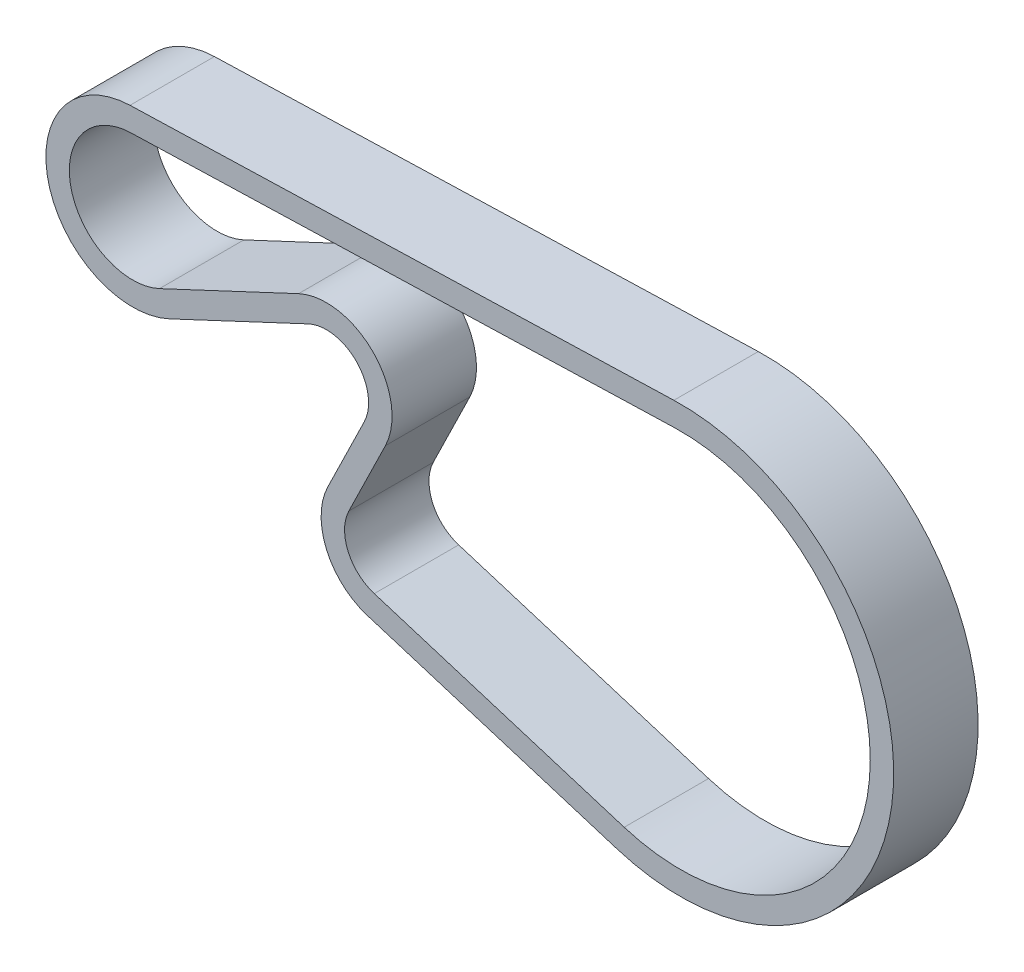
ISO-10303-21;
HEADER;
FILE_DESCRIPTION(('STEP AP214'),'2;1');
FILE_NAME('part.step','',(''),(''),'','','');
FILE_SCHEMA(('AUTOMOTIVE_DESIGN { 1 0 10303 214 1 1 1 1 }'));
ENDSEC;
DATA;
#1=APPLICATION_CONTEXT('core data for automotive mechanical design processes');
#2=APPLICATION_PROTOCOL_DEFINITION('international standard','automotive_design',2000,#1);
#3=PRODUCT_CONTEXT('',#1,'mechanical');
#4=PRODUCT('Part','Part','',(#3));
#5=PRODUCT_RELATED_PRODUCT_CATEGORY('part','',(#4));
#6=PRODUCT_DEFINITION_FORMATION('','',#4);
#7=PRODUCT_DEFINITION_CONTEXT('part definition',#1,'design');
#8=PRODUCT_DEFINITION('design','',#6,#7);
#9=PRODUCT_DEFINITION_SHAPE('','',#8);
#10=(LENGTH_UNIT() NAMED_UNIT(*) SI_UNIT(.MILLI.,.METRE.));
#11=(NAMED_UNIT(*) PLANE_ANGLE_UNIT() SI_UNIT($,.RADIAN.));
#12=(NAMED_UNIT(*) SI_UNIT($,.STERADIAN.) SOLID_ANGLE_UNIT());
#13=UNCERTAINTY_MEASURE_WITH_UNIT(LENGTH_MEASURE(1.E-05),#10,'distance_accuracy_value','');
#14=(GEOMETRIC_REPRESENTATION_CONTEXT(3) GLOBAL_UNCERTAINTY_ASSIGNED_CONTEXT((#13)) GLOBAL_UNIT_ASSIGNED_CONTEXT((#10,
#11,#12)) REPRESENTATION_CONTEXT('',''));
#15=CARTESIAN_POINT('',(0.,0.,0.));
#16=DIRECTION('',(0.,0.,1.));
#17=DIRECTION('',(1.,0.,0.));
#18=AXIS2_PLACEMENT_3D('',#15,#16,#17);
#19=CARTESIAN_POINT('',(108.474760740277,-125.042647423349,-8.));
#20=DIRECTION('',(0.,0.,1.));
#21=DIRECTION('',(1.,0.,0.));
#22=AXIS2_PLACEMENT_3D('',#19,#20,#21);
#23=CYLINDRICAL_SURFACE('',#22,28.);
#24=DIRECTION('',(0.,0.,1.));
#25=VECTOR('',#24,1.);
#26=CARTESIAN_POINT('',(100.191052218173,-151.789239227182,-8.));
#27=LINE('',#26,#25);
#28=CARTESIAN_POINT('',(100.191052218173,-151.789239227182,-8.));
#29=VERTEX_POINT('',#28);
#30=CARTESIAN_POINT('',(100.191052218173,-151.789239227182,28.));
#31=VERTEX_POINT('',#30);
#32=EDGE_CURVE('E140',#29,#31,#27,.T.);
#33=ORIENTED_EDGE('',*,*,#32,.T.);
#34=CARTESIAN_POINT('',(108.474760740277,-125.042647423349,28.));
#35=DIRECTION('',(0.,0.,1.));
#36=DIRECTION('',(1.,0.,0.));
#37=AXIS2_PLACEMENT_3D('',#34,#35,#36);
#38=CIRCLE('',#37,28.);
#39=CARTESIAN_POINT('',(83.3166482224011,-112.75161921014,28.));
#40=VERTEX_POINT('',#39);
#41=EDGE_CURVE('E308',#40,#31,#38,.T.);
#42=ORIENTED_EDGE('',*,*,#41,.F.);
#43=DIRECTION('',(0.,0.,1.));
#44=VECTOR('',#43,1.);
#45=CARTESIAN_POINT('',(83.3166482224011,-112.75161921014,-8.00000000000001));
#46=LINE('',#45,#44);
#47=CARTESIAN_POINT('',(83.3166482224011,-112.75161921014,-8.00000000000001));
#48=VERTEX_POINT('',#47);
#49=EDGE_CURVE('E12',#48,#40,#46,.T.);
#50=ORIENTED_EDGE('',*,*,#49,.F.);
#51=CARTESIAN_POINT('',(108.474760740277,-125.042647423349,-8.));
#52=DIRECTION('',(0.,0.,1.));
#53=DIRECTION('',(1.,0.,0.));
#54=AXIS2_PLACEMENT_3D('',#51,#52,#53);
#55=CIRCLE('',#54,28.);
#56=EDGE_CURVE('E359',#48,#29,#55,.T.);
#57=ORIENTED_EDGE('',*,*,#56,.T.);
#58=EDGE_LOOP('',(#33,#42,#50,#57));
#59=FACE_BOUND('',#58,.T.);
#60=ADVANCED_FACE('F137',(#59),#23,.T.);
#61=CARTESIAN_POINT('',(83.3166482224011,-112.75161921014,-8.));
#62=DIRECTION('',(-0.898504018495562,0.4389652933289,0.));
#63=DIRECTION('',(-0.4389652933289,-0.898504018495562,0.));
#64=AXIS2_PLACEMENT_3D('',#61,#62,#63);
#65=PLANE('',#64);
#66=ORIENTED_EDGE('',*,*,#49,.T.);
#67=DIRECTION('',(-0.4389652933289,-0.898504018495562,0.));
#68=VECTOR('',#67,1.);
#69=CARTESIAN_POINT('',(83.3166482224011,-112.75161921014,28.));
#70=LINE('',#69,#68);
#71=CARTESIAN_POINT('',(98.908753855671,-80.8366369069642,28.));
#72=VERTEX_POINT('',#71);
#73=EDGE_CURVE('E333',#72,#40,#70,.T.);
#74=ORIENTED_EDGE('',*,*,#73,.F.);
#75=DIRECTION('',(0.,0.,1.));
#76=VECTOR('',#75,1.);
#77=CARTESIAN_POINT('',(98.908753855671,-80.8366369069642,-8.));
#78=LINE('',#77,#76);
#79=CARTESIAN_POINT('',(98.908753855671,-80.8366369069642,-8.));
#80=VERTEX_POINT('',#79);
#81=EDGE_CURVE('E145',#80,#72,#78,.T.);
#82=ORIENTED_EDGE('',*,*,#81,.F.);
#83=DIRECTION('',(-0.4389652933289,-0.898504018495562,0.));
#84=VECTOR('',#83,1.);
#85=CARTESIAN_POINT('',(83.3166482224011,-112.75161921014,-8.));
#86=LINE('',#85,#84);
#87=EDGE_CURVE('E397',#80,#48,#86,.T.);
#88=ORIENTED_EDGE('',*,*,#87,.T.);
#89=EDGE_LOOP('',(#66,#74,#82,#88));
#90=FACE_BOUND('',#89,.T.);
#91=ADVANCED_FACE('F421',(#90),#65,.T.);
#92=CARTESIAN_POINT('',(82.735681522751,-72.9352616270441,-8.));
#93=DIRECTION('',(0.,0.,1.));
#94=DIRECTION('',(1.,0.,0.));
#95=AXIS2_PLACEMENT_3D('',#92,#93,#94);
#96=CYLINDRICAL_SURFACE('',#95,18.);
#97=ORIENTED_EDGE('',*,*,#81,.T.);
#98=CARTESIAN_POINT('',(82.735681522751,-72.9352616270441,28.));
#99=DIRECTION('',(0.,0.,1.));
#100=DIRECTION('',(1.,0.,0.));
#101=AXIS2_PLACEMENT_3D('',#98,#99,#100);
#102=CIRCLE('',#101,18.);
#103=CARTESIAN_POINT('',(75.0976330502479,-56.6361752866477,28.));
#104=VERTEX_POINT('',#103);
#105=EDGE_CURVE('E329',#104,#72,#102,.F.);
#106=ORIENTED_EDGE('',*,*,#105,.F.);
#107=DIRECTION('',(0.,0.,1.));
#108=VECTOR('',#107,1.);
#109=CARTESIAN_POINT('',(75.0976330502479,-56.6361752866477,-8.00000000000001));
#110=LINE('',#109,#108);
#111=CARTESIAN_POINT('',(75.0976330502479,-56.6361752866477,-8.00000000000001));
#112=VERTEX_POINT('',#111);
#113=EDGE_CURVE('E401',#112,#104,#110,.T.);
#114=ORIENTED_EDGE('',*,*,#113,.F.);
#115=CARTESIAN_POINT('',(82.735681522751,-72.9352616270441,-8.));
#116=DIRECTION('',(0.,0.,1.));
#117=DIRECTION('',(1.,0.,0.));
#118=AXIS2_PLACEMENT_3D('',#115,#116,#117);
#119=CIRCLE('',#118,18.);
#120=EDGE_CURVE('E393',#112,#80,#119,.F.);
#121=ORIENTED_EDGE('',*,*,#120,.T.);
#122=EDGE_LOOP('',(#97,#106,#114,#121));
#123=FACE_BOUND('',#122,.T.);
#124=ADVANCED_FACE('F442',(#123),#96,.F.);
#125=CARTESIAN_POINT('',(75.0976330502479,-56.6361752866477,-8.));
#126=DIRECTION('',(0.424336026250168,-0.905504796688685,0.));
#127=DIRECTION('',(0.905504796688685,0.424336026250168,0.));
#128=AXIS2_PLACEMENT_3D('',#125,#126,#127);
#129=PLANE('',#128);
#130=ORIENTED_EDGE('',*,*,#113,.T.);
#131=DIRECTION('',(0.905504796688685,0.424336026250168,0.));
#132=VECTOR('',#131,1.);
#133=CARTESIAN_POINT('',(75.0976330502479,-56.6361752866477,28.));
#134=LINE('',#133,#132);
#135=CARTESIAN_POINT('',(15.7799727563137,-84.4335103727026,28.));
#136=VERTEX_POINT('',#135);
#137=EDGE_CURVE('E325',#136,#104,#134,.T.);
#138=ORIENTED_EDGE('',*,*,#137,.F.);
#139=DIRECTION('',(0.,0.,1.));
#140=VECTOR('',#139,1.);
#141=CARTESIAN_POINT('',(15.7799727563137,-84.4335103727026,-8.));
#142=LINE('',#141,#140);
#143=CARTESIAN_POINT('',(15.7799727563137,-84.4335103727026,-8.));
#144=VERTEX_POINT('',#143);
#145=EDGE_CURVE('E404',#144,#136,#142,.T.);
#146=ORIENTED_EDGE('',*,*,#145,.F.);
#147=DIRECTION('',(0.905504796688685,0.424336026250168,0.));
#148=VECTOR('',#147,1.);
#149=CARTESIAN_POINT('',(75.0976330502479,-56.6361752866477,-8.));
#150=LINE('',#149,#148);
#151=EDGE_CURVE('E389',#144,#112,#150,.T.);
#152=ORIENTED_EDGE('',*,*,#151,.T.);
#153=EDGE_LOOP('',(#130,#138,#146,#152));
#154=FACE_BOUND('',#153,.T.);
#155=ADVANCED_FACE('F439',(#154),#129,.T.);
#156=CARTESIAN_POINT('',(0.0795397850574812,-50.9298328952213,-8.));
#157=DIRECTION('',(0.,0.,1.));
#158=DIRECTION('',(1.,0.,0.));
#159=AXIS2_PLACEMENT_3D('',#156,#157,#158);
#160=CYLINDRICAL_SURFACE('',#159,37.);
#161=ORIENTED_EDGE('',*,*,#145,.T.);
#162=CARTESIAN_POINT('',(0.0795397850574812,-50.9298328952213,28.));
#163=DIRECTION('',(0.,0.,1.));
#164=DIRECTION('',(1.,0.,0.));
#165=AXIS2_PLACEMENT_3D('',#162,#163,#164);
#166=CIRCLE('',#165,37.);
#167=CARTESIAN_POINT('',(-1.04109620277107,-13.9468073972609,28.));
#168=VERTEX_POINT('',#167);
#169=EDGE_CURVE('E321',#168,#136,#166,.T.);
#170=ORIENTED_EDGE('',*,*,#169,.F.);
#171=DIRECTION('',(0.,0.,1.));
#172=VECTOR('',#171,1.);
#173=CARTESIAN_POINT('',(-1.04109620277107,-13.9468073972609,-8.00000000000001));
#174=LINE('',#173,#172);
#175=CARTESIAN_POINT('',(-1.04109620277107,-13.9468073972609,-8.00000000000001));
#176=VERTEX_POINT('',#175);
#177=EDGE_CURVE('E407',#176,#168,#174,.T.);
#178=ORIENTED_EDGE('',*,*,#177,.F.);
#179=CARTESIAN_POINT('',(0.0795397850574812,-50.9298328952213,-8.));
#180=DIRECTION('',(0.,0.,1.));
#181=DIRECTION('',(1.,0.,0.));
#182=AXIS2_PLACEMENT_3D('',#179,#180,#181);
#183=CIRCLE('',#182,37.);
#184=EDGE_CURVE('E385',#176,#144,#183,.T.);
#185=ORIENTED_EDGE('',*,*,#184,.T.);
#186=EDGE_LOOP('',(#161,#170,#178,#185));
#187=FACE_BOUND('',#186,.T.);
#188=ADVANCED_FACE('F437',(#187),#160,.T.);
#189=CARTESIAN_POINT('',(230.94875563699,-6.91719926536325,-8.));
#190=DIRECTION('',(-0.0302874591305004,0.999541229674603,0.));
#191=DIRECTION('',(-0.999541229674604,-0.0302874591305004,0.));
#192=AXIS2_PLACEMENT_3D('',#189,#190,#191);
#193=PLANE('',#192);
#194=ORIENTED_EDGE('',*,*,#177,.T.);
#195=DIRECTION('',(-0.999541229674603,-0.0302874591305004,0.));
#196=VECTOR('',#195,1.);
#197=CARTESIAN_POINT('',(230.94875563699,-6.91719926536325,28.));
#198=LINE('',#197,#196);
#199=CARTESIAN_POINT('',(230.94875563699,-6.91719926536326,28.));
#200=VERTEX_POINT('',#199);
#201=EDGE_CURVE('E317',#200,#168,#198,.T.);
#202=ORIENTED_EDGE('',*,*,#201,.F.);
#203=DIRECTION('',(0.,0.,1.));
#204=VECTOR('',#203,1.);
#205=CARTESIAN_POINT('',(230.94875563699,-6.91719926536326,-8.));
#206=LINE('',#205,#204);
#207=CARTESIAN_POINT('',(230.94875563699,-6.91719926536326,-8.));
#208=VERTEX_POINT('',#207);
#209=EDGE_CURVE('E410',#208,#200,#206,.T.);
#210=ORIENTED_EDGE('',*,*,#209,.F.);
#211=DIRECTION('',(-0.999541229674603,-0.0302874591305004,0.));
#212=VECTOR('',#211,1.);
#213=CARTESIAN_POINT('',(230.94875563699,-6.91719926536325,-8.));
#214=LINE('',#213,#212);
#215=EDGE_CURVE('E381',#208,#176,#214,.T.);
#216=ORIENTED_EDGE('',*,*,#215,.T.);
#217=EDGE_LOOP('',(#194,#202,#210,#216));
#218=FACE_BOUND('',#217,.T.);
#219=ADVANCED_FACE('F435',(#218),#193,.T.);
#220=CARTESIAN_POINT('',(233.704914417865,-97.8754511657522,-8.));
#221=DIRECTION('',(0.,0.,1.));
#222=DIRECTION('',(1.,0.,0.));
#223=AXIS2_PLACEMENT_3D('',#220,#221,#222);
#224=CYLINDRICAL_SURFACE('',#223,91.);
#225=ORIENTED_EDGE('',*,*,#209,.T.);
#226=CARTESIAN_POINT('',(233.704914417865,-97.8754511657522,28.));
#227=DIRECTION('',(0.,0.,1.));
#228=DIRECTION('',(1.,0.,0.));
#229=AXIS2_PLACEMENT_3D('',#226,#227,#228);
#230=CIRCLE('',#229,91.);
#231=CARTESIAN_POINT('',(206.782861721027,-184.801874528206,28.));
#232=VERTEX_POINT('',#231);
#233=EDGE_CURVE('E314',#232,#200,#230,.T.);
#234=ORIENTED_EDGE('',*,*,#233,.F.);
#235=DIRECTION('',(0.,0.,1.));
#236=VECTOR('',#235,1.);
#237=CARTESIAN_POINT('',(206.782861721027,-184.801874528206,-8.));
#238=LINE('',#237,#236);
#239=CARTESIAN_POINT('',(206.782861721027,-184.801874528206,-8.));
#240=VERTEX_POINT('',#239);
#241=EDGE_CURVE('E411',#240,#232,#238,.T.);
#242=ORIENTED_EDGE('',*,*,#241,.F.);
#243=CARTESIAN_POINT('',(233.704914417865,-97.8754511657522,-8.));
#244=DIRECTION('',(0.,0.,1.));
#245=DIRECTION('',(1.,0.,0.));
#246=AXIS2_PLACEMENT_3D('',#243,#244,#245);
#247=CIRCLE('',#246,91.);
#248=EDGE_CURVE('E378',#240,#208,#247,.T.);
#249=ORIENTED_EDGE('',*,*,#248,.T.);
#250=EDGE_LOOP('',(#225,#234,#242,#249));
#251=FACE_BOUND('',#250,.T.);
#252=ADVANCED_FACE('F431',(#251),#224,.T.);
#253=CARTESIAN_POINT('',(100.191052218173,-151.789239227182,-8.));
#254=DIRECTION('',(-0.295846732932291,-0.955235421565433,0.));
#255=DIRECTION('',(0.955235421565433,-0.295846732932291,0.));
#256=AXIS2_PLACEMENT_3D('',#253,#254,#255);
#257=PLANE('',#256);
#258=ORIENTED_EDGE('',*,*,#241,.T.);
#259=DIRECTION('',(0.955235421565433,-0.295846732932291,0.));
#260=VECTOR('',#259,1.);
#261=CARTESIAN_POINT('',(100.191052218173,-151.789239227182,28.));
#262=LINE('',#261,#260);
#263=EDGE_CURVE('E311',#31,#232,#262,.T.);
#264=ORIENTED_EDGE('',*,*,#263,.F.);
#265=ORIENTED_EDGE('',*,*,#32,.F.);
#266=DIRECTION('',(0.955235421565433,-0.295846732932291,0.));
#267=VECTOR('',#266,1.);
#268=CARTESIAN_POINT('',(100.191052218173,-151.789239227182,-8.));
#269=LINE('',#268,#267);
#270=EDGE_CURVE('E375',#29,#240,#269,.T.);
#271=ORIENTED_EDGE('',*,*,#270,.T.);
#272=EDGE_LOOP('',(#258,#264,#265,#271));
#273=FACE_BOUND('',#272,.T.);
#274=ADVANCED_FACE('F415',(#273),#257,.T.);
#275=CARTESIAN_POINT('',(108.474760740277,-125.042647423349,-8.));
#276=DIRECTION('',(0.,0.,1.));
#277=DIRECTION('',(1.,0.,0.));
#278=AXIS2_PLACEMENT_3D('',#275,#276,#277);
#279=PLANE('',#278);
#280=DIRECTION('',(-0.4389652933289,-0.898504018495562,0.));
#281=VECTOR('',#280,1.);
#282=CARTESIAN_POINT('',(92.3016884073567,-117.141272143429,-8.));
#283=LINE('',#282,#281);
#284=CARTESIAN_POINT('',(107.893794040627,-85.2262898402533,-8.));
#285=VERTEX_POINT('',#284);
#286=CARTESIAN_POINT('',(92.3016884073567,-117.141272143429,-8.00000000000001));
#287=VERTEX_POINT('',#286);
#288=EDGE_CURVE('E273',#285,#287,#283,.T.);
#289=ORIENTED_EDGE('',*,*,#288,.T.);
#290=CARTESIAN_POINT('',(108.474760740277,-125.042647423349,-8.));
#291=DIRECTION('',(0.,0.,1.));
#292=DIRECTION('',(1.,0.,0.));
#293=AXIS2_PLACEMENT_3D('',#290,#291,#292);
#294=CIRCLE('',#293,18.);
#295=CARTESIAN_POINT('',(103.149519547496,-142.236885011527,-8.));
#296=VERTEX_POINT('',#295);
#297=EDGE_CURVE('E336',#287,#296,#294,.T.);
#298=ORIENTED_EDGE('',*,*,#297,.T.);
#299=DIRECTION('',(0.955235421565433,-0.295846732932291,0.));
#300=VECTOR('',#299,1.);
#301=CARTESIAN_POINT('',(103.149519547496,-142.236885011527,-8.));
#302=LINE('',#301,#300);
#303=CARTESIAN_POINT('',(209.74132905035,-175.249520312552,-8.));
#304=VERTEX_POINT('',#303);
#305=EDGE_CURVE('E268',#296,#304,#302,.T.);
#306=ORIENTED_EDGE('',*,*,#305,.T.);
#307=CARTESIAN_POINT('',(233.704914417865,-97.8754511657522,-8.));
#308=DIRECTION('',(0.,0.,1.));
#309=DIRECTION('',(1.,0.,0.));
#310=AXIS2_PLACEMENT_3D('',#307,#308,#309);
#311=CIRCLE('',#310,81.);
#312=CARTESIAN_POINT('',(231.251630228295,-16.9126115621093,-8.));
#313=VERTEX_POINT('',#312);
#314=EDGE_CURVE('E153',#304,#313,#311,.T.);
#315=ORIENTED_EDGE('',*,*,#314,.T.);
#316=DIRECTION('',(-0.999541229674603,-0.0302874591305004,0.));
#317=VECTOR('',#316,1.);
#318=CARTESIAN_POINT('',(231.251630228295,-16.9126115621093,-8.));
#319=LINE('',#318,#317);
#320=CARTESIAN_POINT('',(-0.738221611466056,-23.942219694007,-8.00000000000001));
#321=VERTEX_POINT('',#320);
#322=EDGE_CURVE('E340',#313,#321,#319,.T.);
#323=ORIENTED_EDGE('',*,*,#322,.T.);
#324=CARTESIAN_POINT('',(0.0795397850574812,-50.9298328952213,-8.));
#325=DIRECTION('',(0.,0.,1.));
#326=DIRECTION('',(1.,0.,0.));
#327=AXIS2_PLACEMENT_3D('',#324,#325,#326);
#328=CIRCLE('',#327,27.);
#329=CARTESIAN_POINT('',(11.536612493812,-75.3784624058158,-8.));
#330=VERTEX_POINT('',#329);
#331=EDGE_CURVE('E344',#321,#330,#328,.T.);
#332=ORIENTED_EDGE('',*,*,#331,.T.);
#333=DIRECTION('',(0.905504796688685,0.424336026250168,0.));
#334=VECTOR('',#333,1.);
#335=CARTESIAN_POINT('',(70.8542727877463,-47.5811273197609,-8.));
#336=LINE('',#335,#334);
#337=CARTESIAN_POINT('',(70.8542727877462,-47.5811273197609,-8.00000000000001));
#338=VERTEX_POINT('',#337);
#339=EDGE_CURVE('E348',#330,#338,#336,.T.);
#340=ORIENTED_EDGE('',*,*,#339,.T.);
#341=CARTESIAN_POINT('',(82.735681522751,-72.9352616270441,-8.));
#342=DIRECTION('',(0.,0.,1.));
#343=DIRECTION('',(1.,0.,0.));
#344=AXIS2_PLACEMENT_3D('',#341,#342,#343);
#345=CIRCLE('',#344,28.);
#346=EDGE_CURVE('E352',#338,#285,#345,.F.);
#347=ORIENTED_EDGE('',*,*,#346,.T.);
#348=EDGE_LOOP('',(#289,#298,#306,#315,#323,#332,#340,#347));
#349=FACE_BOUND('',#348,.T.);
#350=ORIENTED_EDGE('',*,*,#56,.F.);
#351=ORIENTED_EDGE('',*,*,#87,.F.);
#352=ORIENTED_EDGE('',*,*,#120,.F.);
#353=ORIENTED_EDGE('',*,*,#151,.F.);
#354=ORIENTED_EDGE('',*,*,#184,.F.);
#355=ORIENTED_EDGE('',*,*,#215,.F.);
#356=ORIENTED_EDGE('',*,*,#248,.F.);
#357=ORIENTED_EDGE('',*,*,#270,.F.);
#358=EDGE_LOOP('',(#350,#351,#352,#353,#354,#355,#356,#357));
#359=FACE_BOUND('',#358,.T.);
#360=ADVANCED_FACE('F425',(#349,#359),#279,.F.);
#361=CARTESIAN_POINT('',(108.474760740277,-125.042647423349,-8.));
#362=DIRECTION('',(0.,0.,1.));
#363=DIRECTION('',(1.,0.,0.));
#364=AXIS2_PLACEMENT_3D('',#361,#362,#363);
#365=CYLINDRICAL_SURFACE('',#364,18.);
#366=DIRECTION('',(0.,0.,1.));
#367=VECTOR('',#366,1.);
#368=CARTESIAN_POINT('',(92.3016884073567,-117.141272143429,-8.00000000000001));
#369=LINE('',#368,#367);
#370=CARTESIAN_POINT('',(92.3016884073567,-117.141272143429,28.));
#371=VERTEX_POINT('',#370);
#372=EDGE_CURVE('E278',#287,#371,#369,.T.);
#373=ORIENTED_EDGE('',*,*,#372,.T.);
#374=CARTESIAN_POINT('',(108.474760740277,-125.042647423349,28.));
#375=DIRECTION('',(0.,0.,1.));
#376=DIRECTION('',(1.,0.,0.));
#377=AXIS2_PLACEMENT_3D('',#374,#375,#376);
#378=CIRCLE('',#377,18.);
#379=CARTESIAN_POINT('',(103.149519547496,-142.236885011527,28.));
#380=VERTEX_POINT('',#379);
#381=EDGE_CURVE('E276',#371,#380,#378,.T.);
#382=ORIENTED_EDGE('',*,*,#381,.T.);
#383=DIRECTION('',(0.,0.,1.));
#384=VECTOR('',#383,1.);
#385=CARTESIAN_POINT('',(103.149519547496,-142.236885011527,-8.));
#386=LINE('',#385,#384);
#387=EDGE_CURVE('E261',#296,#380,#386,.T.);
#388=ORIENTED_EDGE('',*,*,#387,.F.);
#389=ORIENTED_EDGE('',*,*,#297,.F.);
#390=EDGE_LOOP('',(#373,#382,#388,#389));
#391=FACE_BOUND('',#390,.T.);
#392=ADVANCED_FACE('F277',(#391),#365,.F.);
#393=CARTESIAN_POINT('',(92.3016884073567,-117.141272143429,-8.));
#394=DIRECTION('',(-0.898504018495562,0.4389652933289,0.));
#395=DIRECTION('',(-0.4389652933289,-0.898504018495562,0.));
#396=AXIS2_PLACEMENT_3D('',#393,#394,#395);
#397=PLANE('',#396);
#398=DIRECTION('',(0.,0.,1.));
#399=VECTOR('',#398,1.);
#400=CARTESIAN_POINT('',(107.893794040627,-85.2262898402533,-8.));
#401=LINE('',#400,#399);
#402=CARTESIAN_POINT('',(107.893794040627,-85.2262898402533,28.));
#403=VERTEX_POINT('',#402);
#404=EDGE_CURVE('E360',#285,#403,#401,.T.);
#405=ORIENTED_EDGE('',*,*,#404,.T.);
#406=DIRECTION('',(-0.4389652933289,-0.898504018495562,0.));
#407=VECTOR('',#406,1.);
#408=CARTESIAN_POINT('',(92.3016884073567,-117.141272143429,28.));
#409=LINE('',#408,#407);
#410=EDGE_CURVE('E306',#403,#371,#409,.T.);
#411=ORIENTED_EDGE('',*,*,#410,.T.);
#412=ORIENTED_EDGE('',*,*,#372,.F.);
#413=ORIENTED_EDGE('',*,*,#288,.F.);
#414=EDGE_LOOP('',(#405,#411,#412,#413));
#415=FACE_BOUND('',#414,.T.);
#416=ADVANCED_FACE('F520',(#415),#397,.F.);
#417=CARTESIAN_POINT('',(82.735681522751,-72.9352616270441,-8.));
#418=DIRECTION('',(0.,0.,1.));
#419=DIRECTION('',(1.,0.,0.));
#420=AXIS2_PLACEMENT_3D('',#417,#418,#419);
#421=CYLINDRICAL_SURFACE('',#420,28.);
#422=DIRECTION('',(0.,0.,1.));
#423=VECTOR('',#422,1.);
#424=CARTESIAN_POINT('',(70.8542727877462,-47.5811273197609,-8.00000000000001));
#425=LINE('',#424,#423);
#426=CARTESIAN_POINT('',(70.8542727877462,-47.5811273197609,28.));
#427=VERTEX_POINT('',#426);
#428=EDGE_CURVE('E362',#338,#427,#425,.T.);
#429=ORIENTED_EDGE('',*,*,#428,.T.);
#430=CARTESIAN_POINT('',(82.735681522751,-72.9352616270441,28.));
#431=DIRECTION('',(0.,0.,1.));
#432=DIRECTION('',(1.,0.,0.));
#433=AXIS2_PLACEMENT_3D('',#430,#431,#432);
#434=CIRCLE('',#433,28.);
#435=EDGE_CURVE('E302',#427,#403,#434,.F.);
#436=ORIENTED_EDGE('',*,*,#435,.T.);
#437=ORIENTED_EDGE('',*,*,#404,.F.);
#438=ORIENTED_EDGE('',*,*,#346,.F.);
#439=EDGE_LOOP('',(#429,#436,#437,#438));
#440=FACE_BOUND('',#439,.T.);
#441=ADVANCED_FACE('F529',(#440),#421,.T.);
#442=CARTESIAN_POINT('',(70.8542727877463,-47.5811273197609,-8.));
#443=DIRECTION('',(0.424336026250168,-0.905504796688685,0.));
#444=DIRECTION('',(0.905504796688685,0.424336026250168,0.));
#445=AXIS2_PLACEMENT_3D('',#442,#443,#444);
#446=PLANE('',#445);
#447=DIRECTION('',(0.,0.,1.));
#448=VECTOR('',#447,1.);
#449=CARTESIAN_POINT('',(11.536612493812,-75.3784624058158,-8.));
#450=LINE('',#449,#448);
#451=CARTESIAN_POINT('',(11.536612493812,-75.3784624058158,28.));
#452=VERTEX_POINT('',#451);
#453=EDGE_CURVE('E365',#330,#452,#450,.T.);
#454=ORIENTED_EDGE('',*,*,#453,.T.);
#455=DIRECTION('',(0.905504796688685,0.424336026250168,0.));
#456=VECTOR('',#455,1.);
#457=CARTESIAN_POINT('',(70.8542727877463,-47.5811273197609,28.));
#458=LINE('',#457,#456);
#459=EDGE_CURVE('E298',#452,#427,#458,.T.);
#460=ORIENTED_EDGE('',*,*,#459,.T.);
#461=ORIENTED_EDGE('',*,*,#428,.F.);
#462=ORIENTED_EDGE('',*,*,#339,.F.);
#463=EDGE_LOOP('',(#454,#460,#461,#462));
#464=FACE_BOUND('',#463,.T.);
#465=ADVANCED_FACE('F539',(#464),#446,.F.);
#466=CARTESIAN_POINT('',(0.0795397850574812,-50.9298328952213,-8.));
#467=DIRECTION('',(0.,0.,1.));
#468=DIRECTION('',(1.,0.,0.));
#469=AXIS2_PLACEMENT_3D('',#466,#467,#468);
#470=CYLINDRICAL_SURFACE('',#469,27.);
#471=DIRECTION('',(0.,0.,1.));
#472=VECTOR('',#471,1.);
#473=CARTESIAN_POINT('',(-0.738221611466056,-23.942219694007,-8.00000000000001));
#474=LINE('',#473,#472);
#475=CARTESIAN_POINT('',(-0.738221611466056,-23.942219694007,28.));
#476=VERTEX_POINT('',#475);
#477=EDGE_CURVE('E368',#321,#476,#474,.T.);
#478=ORIENTED_EDGE('',*,*,#477,.T.);
#479=CARTESIAN_POINT('',(0.0795397850574812,-50.9298328952213,28.));
#480=DIRECTION('',(0.,0.,1.));
#481=DIRECTION('',(1.,0.,0.));
#482=AXIS2_PLACEMENT_3D('',#479,#480,#481);
#483=CIRCLE('',#482,27.);
#484=EDGE_CURVE('E294',#476,#452,#483,.T.);
#485=ORIENTED_EDGE('',*,*,#484,.T.);
#486=ORIENTED_EDGE('',*,*,#453,.F.);
#487=ORIENTED_EDGE('',*,*,#331,.F.);
#488=EDGE_LOOP('',(#478,#485,#486,#487));
#489=FACE_BOUND('',#488,.T.);
#490=ADVANCED_FACE('F549',(#489),#470,.F.);
#491=CARTESIAN_POINT('',(231.251630228295,-16.9126115621093,-8.));
#492=DIRECTION('',(-0.0302874591305004,0.999541229674603,0.));
#493=DIRECTION('',(-0.999541229674604,-0.0302874591305004,0.));
#494=AXIS2_PLACEMENT_3D('',#491,#492,#493);
#495=PLANE('',#494);
#496=DIRECTION('',(0.,0.,1.));
#497=VECTOR('',#496,1.);
#498=CARTESIAN_POINT('',(231.251630228295,-16.9126115621093,-8.));
#499=LINE('',#498,#497);
#500=CARTESIAN_POINT('',(231.251630228295,-16.9126115621093,28.));
#501=VERTEX_POINT('',#500);
#502=EDGE_CURVE('E371',#313,#501,#499,.T.);
#503=ORIENTED_EDGE('',*,*,#502,.T.);
#504=DIRECTION('',(-0.999541229674603,-0.0302874591305004,0.));
#505=VECTOR('',#504,1.);
#506=CARTESIAN_POINT('',(231.251630228295,-16.9126115621093,28.));
#507=LINE('',#506,#505);
#508=EDGE_CURVE('E288',#501,#476,#507,.T.);
#509=ORIENTED_EDGE('',*,*,#508,.T.);
#510=ORIENTED_EDGE('',*,*,#477,.F.);
#511=ORIENTED_EDGE('',*,*,#322,.F.);
#512=EDGE_LOOP('',(#503,#509,#510,#511));
#513=FACE_BOUND('',#512,.T.);
#514=ADVANCED_FACE('F559',(#513),#495,.F.);
#515=CARTESIAN_POINT('',(233.704914417865,-97.8754511657522,-8.));
#516=DIRECTION('',(0.,0.,1.));
#517=DIRECTION('',(1.,0.,0.));
#518=AXIS2_PLACEMENT_3D('',#515,#516,#517);
#519=CYLINDRICAL_SURFACE('',#518,81.);
#520=DIRECTION('',(0.,0.,1.));
#521=VECTOR('',#520,1.);
#522=CARTESIAN_POINT('',(209.74132905035,-175.249520312552,-8.));
#523=LINE('',#522,#521);
#524=CARTESIAN_POINT('',(209.74132905035,-175.249520312552,28.));
#525=VERTEX_POINT('',#524);
#526=EDGE_CURVE('E272',#304,#525,#523,.T.);
#527=ORIENTED_EDGE('',*,*,#526,.T.);
#528=CARTESIAN_POINT('',(233.704914417865,-97.8754511657522,28.));
#529=DIRECTION('',(0.,0.,1.));
#530=DIRECTION('',(1.,0.,0.));
#531=AXIS2_PLACEMENT_3D('',#528,#529,#530);
#532=CIRCLE('',#531,81.);
#533=EDGE_CURVE('E286',#525,#501,#532,.T.);
#534=ORIENTED_EDGE('',*,*,#533,.T.);
#535=ORIENTED_EDGE('',*,*,#502,.F.);
#536=ORIENTED_EDGE('',*,*,#314,.F.);
#537=EDGE_LOOP('',(#527,#534,#535,#536));
#538=FACE_BOUND('',#537,.T.);
#539=ADVANCED_FACE('F568',(#538),#519,.F.);
#540=CARTESIAN_POINT('',(103.149519547496,-142.236885011527,-8.));
#541=DIRECTION('',(-0.295846732932291,-0.955235421565433,0.));
#542=DIRECTION('',(0.955235421565433,-0.295846732932291,0.));
#543=AXIS2_PLACEMENT_3D('',#540,#541,#542);
#544=PLANE('',#543);
#545=ORIENTED_EDGE('',*,*,#387,.T.);
#546=DIRECTION('',(0.955235421565433,-0.295846732932291,0.));
#547=VECTOR('',#546,1.);
#548=CARTESIAN_POINT('',(103.149519547496,-142.236885011527,28.));
#549=LINE('',#548,#547);
#550=EDGE_CURVE('E265',#380,#525,#549,.T.);
#551=ORIENTED_EDGE('',*,*,#550,.T.);
#552=ORIENTED_EDGE('',*,*,#526,.F.);
#553=ORIENTED_EDGE('',*,*,#305,.F.);
#554=EDGE_LOOP('',(#545,#551,#552,#553));
#555=FACE_BOUND('',#554,.T.);
#556=ADVANCED_FACE('F263',(#555),#544,.F.);
#557=CARTESIAN_POINT('',(108.474760740277,-125.042647423349,28.));
#558=DIRECTION('',(0.,0.,1.));
#559=DIRECTION('',(1.,0.,0.));
#560=AXIS2_PLACEMENT_3D('',#557,#558,#559);
#561=PLANE('',#560);
#562=ORIENTED_EDGE('',*,*,#41,.T.);
#563=ORIENTED_EDGE('',*,*,#263,.T.);
#564=ORIENTED_EDGE('',*,*,#233,.T.);
#565=ORIENTED_EDGE('',*,*,#201,.T.);
#566=ORIENTED_EDGE('',*,*,#169,.T.);
#567=ORIENTED_EDGE('',*,*,#137,.T.);
#568=ORIENTED_EDGE('',*,*,#105,.T.);
#569=ORIENTED_EDGE('',*,*,#73,.T.);
#570=EDGE_LOOP('',(#562,#563,#564,#565,#566,#567,#568,#569));
#571=FACE_BOUND('',#570,.T.);
#572=ORIENTED_EDGE('',*,*,#550,.F.);
#573=ORIENTED_EDGE('',*,*,#381,.F.);
#574=ORIENTED_EDGE('',*,*,#410,.F.);
#575=ORIENTED_EDGE('',*,*,#435,.F.);
#576=ORIENTED_EDGE('',*,*,#459,.F.);
#577=ORIENTED_EDGE('',*,*,#484,.F.);
#578=ORIENTED_EDGE('',*,*,#508,.F.);
#579=ORIENTED_EDGE('',*,*,#533,.F.);
#580=EDGE_LOOP('',(#572,#573,#574,#575,#576,#577,#578,#579));
#581=FACE_BOUND('',#580,.T.);
#582=ADVANCED_FACE('F283',(#571,#581),#561,.T.);
#583=CLOSED_SHELL('',(#60,#91,#124,#155,#188,#219,#252,#274,#360,#392,#416,#441,#465,#490,#514,
#539,#556,#582));
#584=MANIFOLD_SOLID_BREP('B2',#583);
#585=ADVANCED_BREP_SHAPE_REPRESENTATION('',(#18,#584),#14);
#586=SHAPE_DEFINITION_REPRESENTATION(#9,#585);
ENDSEC;
END-ISO-10303-21;
